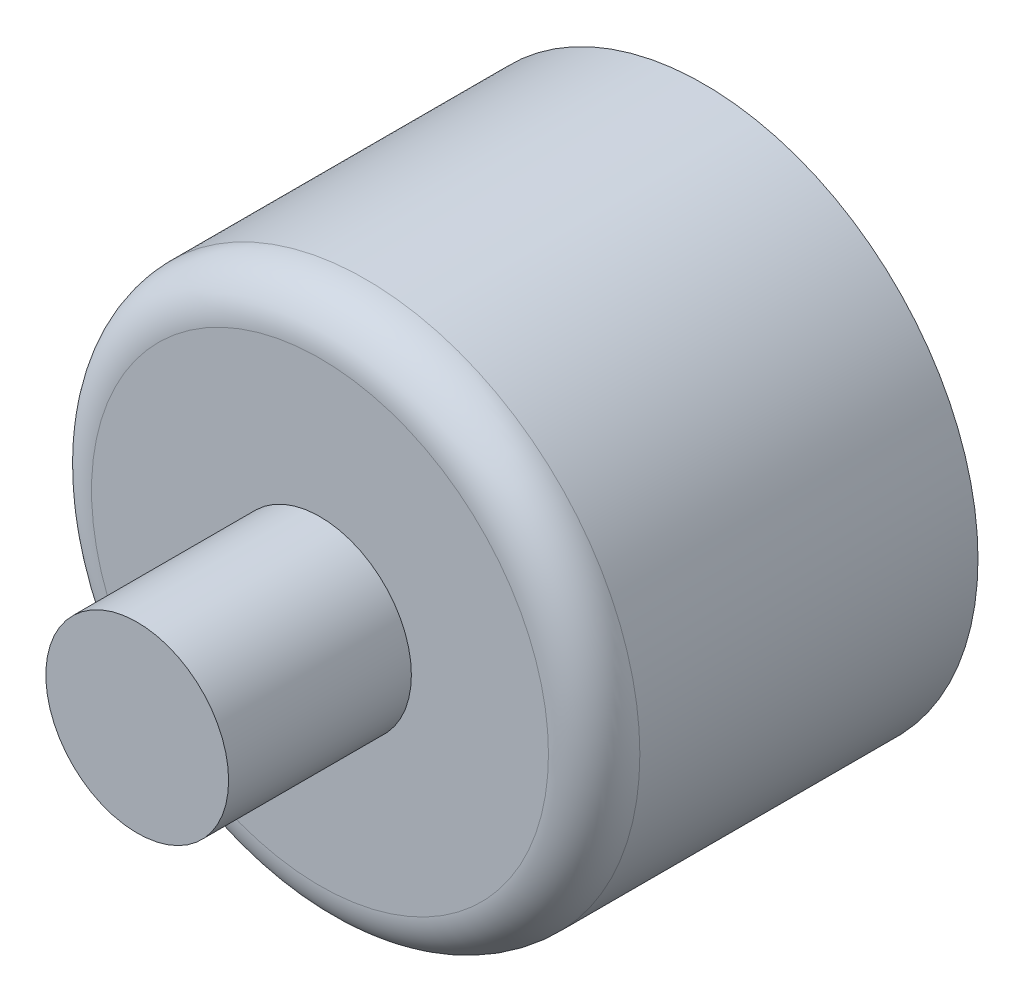
ISO-10303-21;
HEADER;
FILE_DESCRIPTION(('STEP AP214'),'2;1');
FILE_NAME('part.step','',(''),(''),'','','');
FILE_SCHEMA(('AUTOMOTIVE_DESIGN { 1 0 10303 214 1 1 1 1 }'));
ENDSEC;
DATA;
#1=APPLICATION_CONTEXT('core data for automotive mechanical design processes');
#2=APPLICATION_PROTOCOL_DEFINITION('international standard','automotive_design',2000,#1);
#3=PRODUCT_CONTEXT('',#1,'mechanical');
#4=PRODUCT('Part','Part','',(#3));
#5=PRODUCT_RELATED_PRODUCT_CATEGORY('part','',(#4));
#6=PRODUCT_DEFINITION_FORMATION('','',#4);
#7=PRODUCT_DEFINITION_CONTEXT('part definition',#1,'design');
#8=PRODUCT_DEFINITION('design','',#6,#7);
#9=PRODUCT_DEFINITION_SHAPE('','',#8);
#10=(LENGTH_UNIT() NAMED_UNIT(*) SI_UNIT(.MILLI.,.METRE.));
#11=(NAMED_UNIT(*) PLANE_ANGLE_UNIT() SI_UNIT($,.RADIAN.));
#12=(NAMED_UNIT(*) SI_UNIT($,.STERADIAN.) SOLID_ANGLE_UNIT());
#13=UNCERTAINTY_MEASURE_WITH_UNIT(LENGTH_MEASURE(1.E-05),#10,'distance_accuracy_value','');
#14=(GEOMETRIC_REPRESENTATION_CONTEXT(3) GLOBAL_UNCERTAINTY_ASSIGNED_CONTEXT((#13)) GLOBAL_UNIT_ASSIGNED_CONTEXT((#10,
#11,#12)) REPRESENTATION_CONTEXT('',''));
#15=CARTESIAN_POINT('',(0.,0.,0.));
#16=DIRECTION('',(0.,0.,1.));
#17=DIRECTION('',(1.,0.,0.));
#18=AXIS2_PLACEMENT_3D('',#15,#16,#17);
#19=CARTESIAN_POINT('',(-2.64198275862068,-32.,20.7160344827588));
#20=DIRECTION('',(0.,1.,0.));
#21=DIRECTION('',(0.,0.,1.));
#22=AXIS2_PLACEMENT_3D('',#19,#20,#21);
#23=CYLINDRICAL_SURFACE('',#22,1.57591954022988);
#24=CARTESIAN_POINT('',(-2.64198275862068,-30.,20.7160344827588));
#25=DIRECTION('',(0.,1.,0.));
#26=DIRECTION('',(0.,0.,1.));
#27=AXIS2_PLACEMENT_3D('',#24,#25,#26);
#28=CIRCLE('',#27,1.57591954022988);
#29=CARTESIAN_POINT('',(-2.64198275862068,-30.,19.1401149425289));
#30=VERTEX_POINT('',#29);
#31=CARTESIAN_POINT('',(-2.64198275862068,-30.,22.2919540229887));
#32=VERTEX_POINT('',#31);
#33=EDGE_CURVE('E126',#30,#32,#28,.T.);
#34=ORIENTED_EDGE('',*,*,#33,.F.);
#35=DIRECTION('',(0.,1.,0.));
#36=VECTOR('',#35,1.);
#37=CARTESIAN_POINT('',(-2.64198275862068,-32.,19.1401149425289));
#38=LINE('',#37,#36);
#39=CARTESIAN_POINT('',(-2.64198275862068,-32.,19.1401149425289));
#40=VERTEX_POINT('',#39);
#41=EDGE_CURVE('E12',#40,#30,#38,.T.);
#42=ORIENTED_EDGE('',*,*,#41,.F.);
#43=CARTESIAN_POINT('',(-2.64198275862068,-32.,20.7160344827588));
#44=DIRECTION('',(0.,1.,0.));
#45=DIRECTION('',(0.,0.,1.));
#46=AXIS2_PLACEMENT_3D('',#43,#44,#45);
#47=CIRCLE('',#46,1.57591954022988);
#48=CARTESIAN_POINT('',(-2.64198275862068,-32.,22.2919540229887));
#49=VERTEX_POINT('',#48);
#50=EDGE_CURVE('E118',#40,#49,#47,.T.);
#51=ORIENTED_EDGE('',*,*,#50,.T.);
#52=DIRECTION('',(0.,1.,0.));
#53=VECTOR('',#52,1.);
#54=CARTESIAN_POINT('',(-2.64198275862068,-32.,22.2919540229887));
#55=LINE('',#54,#53);
#56=EDGE_CURVE('E59',#49,#32,#55,.T.);
#57=ORIENTED_EDGE('',*,*,#56,.T.);
#58=EDGE_LOOP('',(#34,#42,#51,#57));
#59=FACE_BOUND('',#58,.T.);
#60=ADVANCED_FACE('F56',(#59),#23,.T.);
#61=CARTESIAN_POINT('',(-2.64198275862068,-32.,19.1401149425289));
#62=DIRECTION('',(0.,0.,-1.));
#63=DIRECTION('',(-1.,0.,0.));
#64=AXIS2_PLACEMENT_3D('',#61,#62,#63);
#65=PLANE('',#64);
#66=DIRECTION('',(-1.,0.,0.));
#67=VECTOR('',#66,1.);
#68=CARTESIAN_POINT('',(-2.64198275862068,-30.,19.1401149425289));
#69=LINE('',#68,#67);
#70=CARTESIAN_POINT('',(2.64198275862068,-30.,19.1401149425289));
#71=VERTEX_POINT('',#70);
#72=EDGE_CURVE('E122',#71,#30,#69,.T.);
#73=ORIENTED_EDGE('',*,*,#72,.F.);
#74=DIRECTION('',(0.,1.,0.));
#75=VECTOR('',#74,1.);
#76=CARTESIAN_POINT('',(2.64198275862068,-32.,19.1401149425289));
#77=LINE('',#76,#75);
#78=CARTESIAN_POINT('',(2.64198275862068,-32.,19.1401149425289));
#79=VERTEX_POINT('',#78);
#80=EDGE_CURVE('E66',#79,#71,#77,.T.);
#81=ORIENTED_EDGE('',*,*,#80,.F.);
#82=DIRECTION('',(-1.,0.,0.));
#83=VECTOR('',#82,1.);
#84=CARTESIAN_POINT('',(-2.64198275862068,-32.,19.1401149425289));
#85=LINE('',#84,#83);
#86=EDGE_CURVE('E113',#79,#40,#85,.T.);
#87=ORIENTED_EDGE('',*,*,#86,.T.);
#88=ORIENTED_EDGE('',*,*,#41,.T.);
#89=EDGE_LOOP('',(#73,#81,#87,#88));
#90=FACE_BOUND('',#89,.T.);
#91=ADVANCED_FACE('F142',(#90),#65,.T.);
#92=CARTESIAN_POINT('',(2.64198275862068,-32.,20.7160344827588));
#93=DIRECTION('',(0.,1.,0.));
#94=DIRECTION('',(0.,0.,1.));
#95=AXIS2_PLACEMENT_3D('',#92,#93,#94);
#96=CYLINDRICAL_SURFACE('',#95,1.57591954022988);
#97=CARTESIAN_POINT('',(2.64198275862068,-30.,20.7160344827588));
#98=DIRECTION('',(0.,1.,0.));
#99=DIRECTION('',(0.,0.,1.));
#100=AXIS2_PLACEMENT_3D('',#97,#98,#99);
#101=CIRCLE('',#100,1.57591954022988);
#102=CARTESIAN_POINT('',(2.64198275862068,-30.,22.2919540229887));
#103=VERTEX_POINT('',#102);
#104=EDGE_CURVE('E107',#103,#71,#101,.T.);
#105=ORIENTED_EDGE('',*,*,#104,.F.);
#106=DIRECTION('',(0.,1.,0.));
#107=VECTOR('',#106,1.);
#108=CARTESIAN_POINT('',(2.64198275862068,-32.,22.2919540229887));
#109=LINE('',#108,#107);
#110=CARTESIAN_POINT('',(2.64198275862068,-32.,22.2919540229887));
#111=VERTEX_POINT('',#110);
#112=EDGE_CURVE('E102',#111,#103,#109,.T.);
#113=ORIENTED_EDGE('',*,*,#112,.F.);
#114=CARTESIAN_POINT('',(2.64198275862068,-32.,20.7160344827588));
#115=DIRECTION('',(0.,1.,0.));
#116=DIRECTION('',(0.,0.,1.));
#117=AXIS2_PLACEMENT_3D('',#114,#115,#116);
#118=CIRCLE('',#117,1.57591954022988);
#119=EDGE_CURVE('E105',#111,#79,#118,.T.);
#120=ORIENTED_EDGE('',*,*,#119,.T.);
#121=ORIENTED_EDGE('',*,*,#80,.T.);
#122=EDGE_LOOP('',(#105,#113,#120,#121));
#123=FACE_BOUND('',#122,.T.);
#124=ADVANCED_FACE('F104',(#123),#96,.T.);
#125=CARTESIAN_POINT('',(-2.64198275862068,-32.,22.2919540229887));
#126=DIRECTION('',(0.,0.,1.));
#127=DIRECTION('',(1.,0.,0.));
#128=AXIS2_PLACEMENT_3D('',#125,#126,#127);
#129=PLANE('',#128);
#130=DIRECTION('',(1.,0.,0.));
#131=VECTOR('',#130,1.);
#132=CARTESIAN_POINT('',(-2.64198275862068,-30.,22.2919540229887));
#133=LINE('',#132,#131);
#134=EDGE_CURVE('E130',#32,#103,#133,.T.);
#135=ORIENTED_EDGE('',*,*,#134,.F.);
#136=ORIENTED_EDGE('',*,*,#56,.F.);
#137=DIRECTION('',(1.,0.,0.));
#138=VECTOR('',#137,1.);
#139=CARTESIAN_POINT('',(-2.64198275862068,-32.,22.2919540229887));
#140=LINE('',#139,#138);
#141=EDGE_CURVE('E112',#49,#111,#140,.T.);
#142=ORIENTED_EDGE('',*,*,#141,.T.);
#143=ORIENTED_EDGE('',*,*,#112,.T.);
#144=EDGE_LOOP('',(#135,#136,#142,#143));
#145=FACE_BOUND('',#144,.T.);
#146=ADVANCED_FACE('F116',(#145),#129,.T.);
#147=CARTESIAN_POINT('',(-2.64198275862068,-32.,20.7160344827588));
#148=DIRECTION('',(0.,1.,0.));
#149=DIRECTION('',(0.,0.,1.));
#150=AXIS2_PLACEMENT_3D('',#147,#148,#149);
#151=PLANE('',#150);
#152=ORIENTED_EDGE('',*,*,#50,.F.);
#153=ORIENTED_EDGE('',*,*,#86,.F.);
#154=ORIENTED_EDGE('',*,*,#119,.F.);
#155=ORIENTED_EDGE('',*,*,#141,.F.);
#156=EDGE_LOOP('',(#152,#153,#154,#155));
#157=FACE_BOUND('',#156,.T.);
#158=ADVANCED_FACE('F111',(#157),#151,.F.);
#159=CARTESIAN_POINT('',(-2.64198275862068,-30.,20.7160344827588));
#160=DIRECTION('',(0.,1.,0.));
#161=DIRECTION('',(0.,0.,1.));
#162=AXIS2_PLACEMENT_3D('',#159,#160,#161);
#163=PLANE('',#162);
#164=ORIENTED_EDGE('',*,*,#33,.T.);
#165=ORIENTED_EDGE('',*,*,#134,.T.);
#166=ORIENTED_EDGE('',*,*,#104,.T.);
#167=ORIENTED_EDGE('',*,*,#72,.T.);
#168=EDGE_LOOP('',(#164,#165,#166,#167));
#169=FACE_BOUND('',#168,.T.);
#170=ADVANCED_FACE('F141',(#169),#163,.T.);
#171=CLOSED_SHELL('',(#60,#91,#124,#146,#158,#170));
#172=MANIFOLD_SOLID_BREP('B2',#171);
#173=CARTESIAN_POINT('',(0.,0.,42.));
#174=DIRECTION('',(0.,0.,-1.));
#175=DIRECTION('',(-1.,0.,0.));
#176=AXIS2_PLACEMENT_3D('',#173,#174,#175);
#177=CYLINDRICAL_SURFACE('',#176,30.);
#178=CARTESIAN_POINT('',(0.,0.,37.));
#179=DIRECTION('',(0.,0.,1.));
#180=DIRECTION('',(1.,0.,0.));
#181=AXIS2_PLACEMENT_3D('',#178,#179,#180);
#182=CIRCLE('',#181,30.);
#183=CARTESIAN_POINT('',(-30.,0.,37.));
#184=VERTEX_POINT('',#183);
#185=EDGE_CURVE('E55',#184,#184,#182,.F.);
#186=CARTESIAN_POINT('',(0.,0.,0.));
#187=DIRECTION('',(0.,0.,1.));
#188=DIRECTION('',(1.,0.,0.));
#189=AXIS2_PLACEMENT_3D('',#186,#187,#188);
#190=CIRCLE('',#189,30.);
#191=CARTESIAN_POINT('',(-30.,0.,0.));
#192=VERTEX_POINT('',#191);
#193=EDGE_CURVE('E229',#192,#192,#190,.T.);
#194=CARTESIAN_POINT('',(-30.,0.,37.));
#195=CARTESIAN_POINT('',(-30.,0.,36.6145833333333));
#196=CARTESIAN_POINT('',(-30.,0.,36.2291666666667));
#197=CARTESIAN_POINT('',(-30.,0.,35.4583333333333));
#198=CARTESIAN_POINT('',(-30.,0.,35.0729166666667));
#199=CARTESIAN_POINT('',(-30.,0.,34.3020833333333));
#200=CARTESIAN_POINT('',(-30.,0.,33.9166666666667));
#201=CARTESIAN_POINT('',(-30.,0.,33.1458333333333));
#202=CARTESIAN_POINT('',(-30.,0.,32.7604166666667));
#203=CARTESIAN_POINT('',(-30.,0.,31.9895833333333));
#204=CARTESIAN_POINT('',(-30.,0.,31.6041666666667));
#205=CARTESIAN_POINT('',(-30.,0.,30.8333333333333));
#206=CARTESIAN_POINT('',(-30.,0.,30.4479166666667));
#207=CARTESIAN_POINT('',(-30.,0.,29.6770833333333));
#208=CARTESIAN_POINT('',(-30.,0.,29.2916666666667));
#209=CARTESIAN_POINT('',(-30.,0.,28.5208333333333));
#210=CARTESIAN_POINT('',(-30.,0.,28.1354166666667));
#211=CARTESIAN_POINT('',(-30.,0.,27.3645833333333));
#212=CARTESIAN_POINT('',(-30.,0.,26.9791666666667));
#213=CARTESIAN_POINT('',(-30.,0.,26.2083333333333));
#214=CARTESIAN_POINT('',(-30.,0.,25.8229166666667));
#215=CARTESIAN_POINT('',(-30.,0.,25.0520833333333));
#216=CARTESIAN_POINT('',(-30.,0.,24.6666666666667));
#217=CARTESIAN_POINT('',(-30.,0.,23.8958333333333));
#218=CARTESIAN_POINT('',(-30.,0.,23.5104166666667));
#219=CARTESIAN_POINT('',(-30.,0.,22.7395833333333));
#220=CARTESIAN_POINT('',(-30.,0.,22.3541666666667));
#221=CARTESIAN_POINT('',(-30.,0.,21.5833333333333));
#222=CARTESIAN_POINT('',(-30.,0.,21.1979166666667));
#223=CARTESIAN_POINT('',(-30.,0.,20.4270833333333));
#224=CARTESIAN_POINT('',(-30.,0.,20.0416666666667));
#225=CARTESIAN_POINT('',(-30.,0.,19.2708333333333));
#226=CARTESIAN_POINT('',(-30.,0.,18.8854166666667));
#227=CARTESIAN_POINT('',(-30.,0.,18.1145833333333));
#228=CARTESIAN_POINT('',(-30.,0.,17.7291666666667));
#229=CARTESIAN_POINT('',(-30.,0.,16.9583333333333));
#230=CARTESIAN_POINT('',(-30.,0.,16.5729166666667));
#231=CARTESIAN_POINT('',(-30.,0.,15.8020833333333));
#232=CARTESIAN_POINT('',(-30.,0.,15.4166666666667));
#233=CARTESIAN_POINT('',(-30.,0.,14.6458333333333));
#234=CARTESIAN_POINT('',(-30.,0.,14.2604166666667));
#235=CARTESIAN_POINT('',(-30.,0.,13.4895833333333));
#236=CARTESIAN_POINT('',(-30.,0.,13.1041666666667));
#237=CARTESIAN_POINT('',(-30.,0.,12.3333333333333));
#238=CARTESIAN_POINT('',(-30.,0.,11.9479166666667));
#239=CARTESIAN_POINT('',(-30.,0.,11.1770833333333));
#240=CARTESIAN_POINT('',(-30.,0.,10.7916666666667));
#241=CARTESIAN_POINT('',(-30.,0.,10.0208333333333));
#242=CARTESIAN_POINT('',(-30.,0.,9.63541666666667));
#243=CARTESIAN_POINT('',(-30.,0.,8.86458333333334));
#244=CARTESIAN_POINT('',(-30.,0.,8.47916666666667));
#245=CARTESIAN_POINT('',(-30.,0.,7.70833333333334));
#246=CARTESIAN_POINT('',(-30.,0.,7.32291666666667));
#247=CARTESIAN_POINT('',(-30.,0.,6.55208333333333));
#248=CARTESIAN_POINT('',(-30.,0.,6.16666666666667));
#249=CARTESIAN_POINT('',(-30.,0.,5.39583333333334));
#250=CARTESIAN_POINT('',(-30.,0.,5.01041666666667));
#251=CARTESIAN_POINT('',(-30.,0.,4.23958333333334));
#252=CARTESIAN_POINT('',(-30.,0.,3.85416666666667));
#253=CARTESIAN_POINT('',(-30.,0.,3.08333333333333));
#254=CARTESIAN_POINT('',(-30.,0.,2.69791666666667));
#255=CARTESIAN_POINT('',(-30.,0.,1.92708333333333));
#256=CARTESIAN_POINT('',(-30.,0.,1.54166666666667));
#257=CARTESIAN_POINT('',(-30.,0.,0.770833333333332));
#258=CARTESIAN_POINT('',(-30.,0.,0.385416666666666));
#259=CARTESIAN_POINT('',(-30.,0.,0.));
#260=B_SPLINE_CURVE_WITH_KNOTS('',3,(#194,#195,#196,#197,#198,#199,#200,#201,#202,#203,#204,
#205,#206,#207,#208,#209,#210,#211,#212,#213,#214,#215,#216,#217,#218,#219,#220,#221,#222,#223,
#224,#225,#226,#227,#228,#229,#230,#231,#232,#233,#234,#235,#236,#237,#238,#239,#240,#241,#242,
#243,#244,#245,#246,#247,#248,#249,#250,#251,#252,#253,#254,#255,#256,#257,#258,#259),
.UNSPECIFIED.,.F.,.F.,(4,2,2,2,2,2,2,2,2,2,2,2,2,2,2,2,2,2,2,2,2,2,2,2,2,2,2,2,2,2,2,2,4),(0.,
1.15625,2.3125,3.46875,4.625,5.78124999999999,6.9375,8.09375,9.25,10.40625,11.5625,12.71875,
13.875,15.03125,16.1875,17.34375,18.5,19.65625,20.8125,21.96875,23.125,24.28125,25.4375,
26.59375,27.75,28.90625,30.0625,31.21875,32.375,33.53125,34.6875,35.84375,37.),.UNSPECIFIED.);
#261=EDGE_CURVE('BSEAM209',#184,#192,#260,.T.);
#262=ORIENTED_EDGE('',*,*,#185,.T.);
#263=ORIENTED_EDGE('',*,*,#193,.T.);
#264=ORIENTED_EDGE('',*,*,#261,.T.);
#265=ORIENTED_EDGE('',*,*,#261,.F.);
#266=EDGE_LOOP('',(#262,#264,#263,#265));
#267=FACE_BOUND('',#266,.T.);
#268=ADVANCED_FACE('F209',(#267),#177,.T.);
#269=CARTESIAN_POINT('',(0.,0.,42.));
#270=DIRECTION('',(0.,0.,1.));
#271=DIRECTION('',(1.,0.,0.));
#272=AXIS2_PLACEMENT_3D('',#269,#270,#271);
#273=PLANE('',#272);
#274=CARTESIAN_POINT('',(0.,0.,42.));
#275=DIRECTION('',(0.,0.,1.));
#276=DIRECTION('',(1.,0.,0.));
#277=AXIS2_PLACEMENT_3D('',#274,#275,#276);
#278=CIRCLE('',#277,25.);
#279=CARTESIAN_POINT('',(25.,0.,42.));
#280=VERTEX_POINT('',#279);
#281=EDGE_CURVE('E217',#280,#280,#278,.T.);
#282=ORIENTED_EDGE('',*,*,#281,.T.);
#283=EDGE_LOOP('',(#282));
#284=FACE_BOUND('',#283,.T.);
#285=CARTESIAN_POINT('',(0.,0.,42.));
#286=DIRECTION('',(0.,0.,1.));
#287=DIRECTION('',(1.,0.,0.));
#288=AXIS2_PLACEMENT_3D('',#285,#286,#287);
#289=CIRCLE('',#288,10.);
#290=CARTESIAN_POINT('',(10.,0.,42.));
#291=VERTEX_POINT('',#290);
#292=EDGE_CURVE('E224',#291,#291,#289,.T.);
#293=ORIENTED_EDGE('',*,*,#292,.F.);
#294=EDGE_LOOP('',(#293));
#295=FACE_BOUND('',#294,.T.);
#296=ADVANCED_FACE('F250',(#284,#295),#273,.T.);
#297=CARTESIAN_POINT('',(0.,0.,0.));
#298=DIRECTION('',(0.,0.,1.));
#299=DIRECTION('',(1.,0.,0.));
#300=AXIS2_PLACEMENT_3D('',#297,#298,#299);
#301=PLANE('',#300);
#302=ORIENTED_EDGE('',*,*,#193,.F.);
#303=EDGE_LOOP('',(#302));
#304=FACE_BOUND('',#303,.T.);
#305=ADVANCED_FACE('F246',(#304),#301,.F.);
#306=CARTESIAN_POINT('',(0.,0.,62.));
#307=DIRECTION('',(0.,0.,-1.));
#308=DIRECTION('',(-1.,0.,0.));
#309=AXIS2_PLACEMENT_3D('',#306,#307,#308);
#310=CYLINDRICAL_SURFACE('',#309,10.);
#311=CARTESIAN_POINT('',(0.,0.,62.));
#312=DIRECTION('',(0.,0.,1.));
#313=DIRECTION('',(1.,0.,0.));
#314=AXIS2_PLACEMENT_3D('',#311,#312,#313);
#315=CIRCLE('',#314,10.);
#316=CARTESIAN_POINT('',(10.,0.,62.));
#317=VERTEX_POINT('',#316);
#318=EDGE_CURVE('E234',#317,#317,#315,.T.);
#319=ORIENTED_EDGE('',*,*,#318,.F.);
#320=EDGE_LOOP('',(#319));
#321=FACE_BOUND('',#320,.T.);
#322=ORIENTED_EDGE('',*,*,#292,.T.);
#323=EDGE_LOOP('',(#322));
#324=FACE_BOUND('',#323,.T.);
#325=ADVANCED_FACE('F243',(#321,#324),#310,.T.);
#326=CARTESIAN_POINT('',(0.,0.,62.));
#327=DIRECTION('',(0.,0.,1.));
#328=DIRECTION('',(1.,0.,0.));
#329=AXIS2_PLACEMENT_3D('',#326,#327,#328);
#330=PLANE('',#329);
#331=ORIENTED_EDGE('',*,*,#318,.T.);
#332=EDGE_LOOP('',(#331));
#333=FACE_BOUND('',#332,.T.);
#334=ADVANCED_FACE('F241',(#333),#330,.T.);
#335=CARTESIAN_POINT('',(0.,0.,37.));
#336=DIRECTION('',(0.,0.,1.));
#337=DIRECTION('',(1.,0.,0.));
#338=AXIS2_PLACEMENT_3D('',#335,#336,#337);
#339=TOROIDAL_SURFACE('',#338,25.,5.);
#340=ORIENTED_EDGE('',*,*,#185,.F.);
#341=EDGE_LOOP('',(#340));
#342=FACE_BOUND('',#341,.T.);
#343=ORIENTED_EDGE('',*,*,#281,.F.);
#344=EDGE_LOOP('',(#343));
#345=FACE_BOUND('',#344,.T.);
#346=ADVANCED_FACE('F211',(#342,#345),#339,.T.);
#347=CLOSED_SHELL('',(#268,#296,#305,#325,#334,#346));
#348=MANIFOLD_SOLID_BREP('B6',#347);
#349=ADVANCED_BREP_SHAPE_REPRESENTATION('',(#18,#172,#348),#14);
#350=SHAPE_DEFINITION_REPRESENTATION(#9,#349);
ENDSEC;
END-ISO-10303-21;
